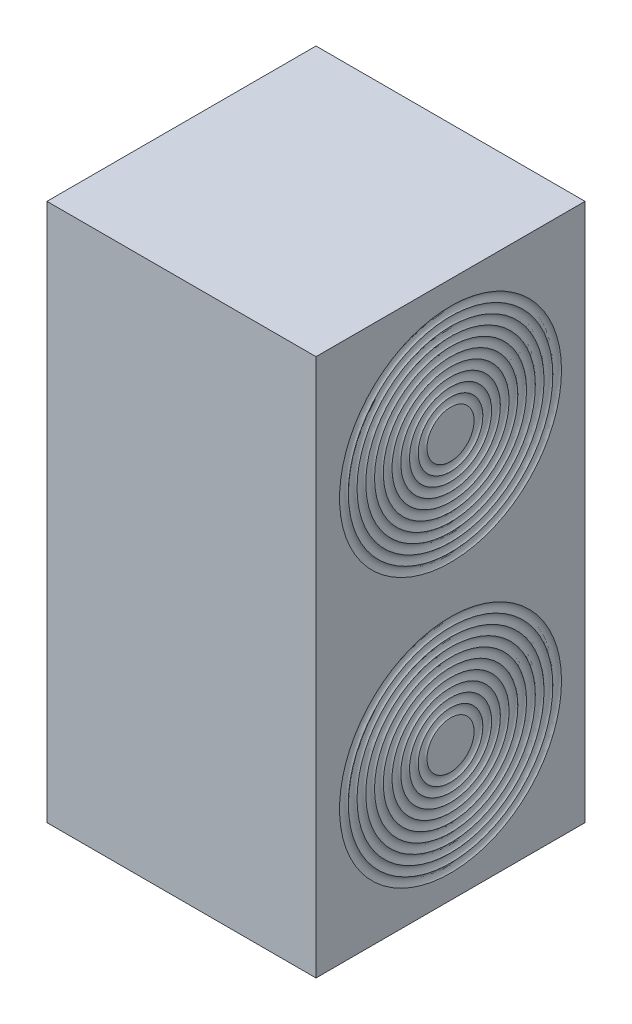
ISO-10303-21;
HEADER;
FILE_DESCRIPTION(('STEP AP214'),'2;1');
FILE_NAME('part.step','',(''),(''),'','','');
FILE_SCHEMA(('AUTOMOTIVE_DESIGN { 1 0 10303 214 1 1 1 1 }'));
ENDSEC;
DATA;
#1=APPLICATION_CONTEXT('core data for automotive mechanical design processes');
#2=APPLICATION_PROTOCOL_DEFINITION('international standard','automotive_design',2000,#1);
#3=PRODUCT_CONTEXT('',#1,'mechanical');
#4=PRODUCT('Part','Part','',(#3));
#5=PRODUCT_RELATED_PRODUCT_CATEGORY('part','',(#4));
#6=PRODUCT_DEFINITION_FORMATION('','',#4);
#7=PRODUCT_DEFINITION_CONTEXT('part definition',#1,'design');
#8=PRODUCT_DEFINITION('design','',#6,#7);
#9=PRODUCT_DEFINITION_SHAPE('','',#8);
#10=(LENGTH_UNIT() NAMED_UNIT(*) SI_UNIT(.MILLI.,.METRE.));
#11=(NAMED_UNIT(*) PLANE_ANGLE_UNIT() SI_UNIT($,.RADIAN.));
#12=(NAMED_UNIT(*) SI_UNIT($,.STERADIAN.) SOLID_ANGLE_UNIT());
#13=UNCERTAINTY_MEASURE_WITH_UNIT(LENGTH_MEASURE(1.E-05),#10,'distance_accuracy_value','');
#14=(GEOMETRIC_REPRESENTATION_CONTEXT(3) GLOBAL_UNCERTAINTY_ASSIGNED_CONTEXT((#13)) GLOBAL_UNIT_ASSIGNED_CONTEXT((#10,
#11,#12)) REPRESENTATION_CONTEXT('',''));
#15=CARTESIAN_POINT('',(0.,0.,0.));
#16=DIRECTION('',(0.,0.,1.));
#17=DIRECTION('',(1.,0.,0.));
#18=AXIS2_PLACEMENT_3D('',#15,#16,#17);
#19=CARTESIAN_POINT('',(-20.,10.,0.));
#20=DIRECTION('',(1.,0.,0.));
#21=DIRECTION('',(0.,0.,-1.));
#22=AXIS2_PLACEMENT_3D('',#19,#20,#21);
#23=PLANE('',#22);
#24=CARTESIAN_POINT('',(-20.,20.,0.));
#25=DIRECTION('',(-1.,0.,0.));
#26=DIRECTION('',(0.,0.,1.));
#27=AXIS2_PLACEMENT_3D('',#24,#25,#26);
#28=CIRCLE('',#27,1.74999999999997);
#29=CARTESIAN_POINT('',(-20.,20.,1.74999999999997));
#30=VERTEX_POINT('',#29);
#31=EDGE_CURVE('E20',#30,#30,#28,.T.);
#32=ORIENTED_EDGE('',*,*,#31,.T.);
#33=EDGE_LOOP('',(#32));
#34=FACE_BOUND('',#33,.T.);
#35=ADVANCED_FACE('F17',(#34),#23,.F.);
#36=CARTESIAN_POINT('',(-20.,10.,0.));
#37=DIRECTION('',(1.,0.,0.));
#38=DIRECTION('',(0.,0.,-1.));
#39=AXIS2_PLACEMENT_3D('',#36,#37,#38);
#40=PLANE('',#39);
#41=CARTESIAN_POINT('',(-20.,0.,0.));
#42=DIRECTION('',(-1.,0.,0.));
#43=DIRECTION('',(0.,0.,1.));
#44=AXIS2_PLACEMENT_3D('',#41,#42,#43);
#45=CIRCLE('',#44,1.74999999999997);
#46=CARTESIAN_POINT('',(-20.,0.,1.74999999999997));
#47=VERTEX_POINT('',#46);
#48=EDGE_CURVE('E477',#47,#47,#45,.T.);
#49=ORIENTED_EDGE('',*,*,#48,.T.);
#50=EDGE_LOOP('',(#49));
#51=FACE_BOUND('',#50,.T.);
#52=ADVANCED_FACE('F431',(#51),#40,.F.);
#53=CARTESIAN_POINT('',(0.,10.,0.));
#54=DIRECTION('',(1.,0.,0.));
#55=DIRECTION('',(0.,0.,-1.));
#56=AXIS2_PLACEMENT_3D('',#53,#54,#55);
#57=PLANE('',#56);
#58=CARTESIAN_POINT('',(0.,20.,0.));
#59=DIRECTION('',(1.,0.,0.));
#60=DIRECTION('',(0.,0.,-1.));
#61=AXIS2_PLACEMENT_3D('',#58,#59,#60);
#62=CIRCLE('',#61,1.75);
#63=CARTESIAN_POINT('',(0.,20.,-1.75));
#64=VERTEX_POINT('',#63);
#65=EDGE_CURVE('E474',#64,#64,#62,.T.);
#66=ORIENTED_EDGE('',*,*,#65,.T.);
#67=EDGE_LOOP('',(#66));
#68=FACE_BOUND('',#67,.T.);
#69=ADVANCED_FACE('F428',(#68),#57,.T.);
#70=CARTESIAN_POINT('',(0.,10.,0.));
#71=DIRECTION('',(1.,0.,0.));
#72=DIRECTION('',(0.,0.,-1.));
#73=AXIS2_PLACEMENT_3D('',#70,#71,#72);
#74=PLANE('',#73);
#75=CARTESIAN_POINT('',(0.,0.,0.));
#76=DIRECTION('',(1.,0.,0.));
#77=DIRECTION('',(0.,0.,-1.));
#78=AXIS2_PLACEMENT_3D('',#75,#76,#77);
#79=CIRCLE('',#78,1.75);
#80=CARTESIAN_POINT('',(0.,0.,-1.75));
#81=VERTEX_POINT('',#80);
#82=EDGE_CURVE('E470',#81,#81,#79,.T.);
#83=ORIENTED_EDGE('',*,*,#82,.T.);
#84=EDGE_LOOP('',(#83));
#85=FACE_BOUND('',#84,.T.);
#86=ADVANCED_FACE('F424',(#85),#74,.T.);
#87=CARTESIAN_POINT('',(-20.2770833333333,20.,0.));
#88=DIRECTION('',(-1.,0.,0.));
#89=DIRECTION('',(0.,0.,-1.));
#90=AXIS2_PLACEMENT_3D('',#87,#88,#89);
#91=TOROIDAL_SURFACE('',#90,2.075,0.427083333333337);
#92=ORIENTED_EDGE('',*,*,#31,.F.);
#93=EDGE_LOOP('',(#92));
#94=FACE_BOUND('',#93,.T.);
#95=CARTESIAN_POINT('',(-20.,20.,0.));
#96=DIRECTION('',(-1.,0.,0.));
#97=DIRECTION('',(0.,0.,-1.));
#98=AXIS2_PLACEMENT_3D('',#95,#96,#97);
#99=CIRCLE('',#98,2.39999999999998);
#100=CARTESIAN_POINT('',(-20.,20.,-2.39999999999998));
#101=VERTEX_POINT('',#100);
#102=EDGE_CURVE('E415',#101,#101,#99,.T.);
#103=ORIENTED_EDGE('',*,*,#102,.T.);
#104=EDGE_LOOP('',(#103));
#105=FACE_BOUND('',#104,.T.);
#106=ADVANCED_FACE('F421',(#94,#105),#91,.F.);
#107=CARTESIAN_POINT('',(-20.2770833333333,0.,0.));
#108=DIRECTION('',(-1.,0.,0.));
#109=DIRECTION('',(0.,0.,-1.));
#110=AXIS2_PLACEMENT_3D('',#107,#108,#109);
#111=TOROIDAL_SURFACE('',#110,2.075,0.427083333333337);
#112=CARTESIAN_POINT('',(-20.,0.,0.));
#113=DIRECTION('',(-1.,0.,0.));
#114=DIRECTION('',(0.,0.,-1.));
#115=AXIS2_PLACEMENT_3D('',#112,#113,#114);
#116=CIRCLE('',#115,2.39999999999998);
#117=CARTESIAN_POINT('',(-20.,0.,-2.39999999999998));
#118=VERTEX_POINT('',#117);
#119=EDGE_CURVE('E412',#118,#118,#116,.T.);
#120=ORIENTED_EDGE('',*,*,#119,.T.);
#121=EDGE_LOOP('',(#120));
#122=FACE_BOUND('',#121,.T.);
#123=ORIENTED_EDGE('',*,*,#48,.F.);
#124=EDGE_LOOP('',(#123));
#125=FACE_BOUND('',#124,.T.);
#126=ADVANCED_FACE('F406',(#122,#125),#111,.F.);
#127=CARTESIAN_POINT('',(0.277083333333337,20.,0.));
#128=DIRECTION('',(1.,0.,0.));
#129=DIRECTION('',(0.,0.,-1.));
#130=AXIS2_PLACEMENT_3D('',#127,#128,#129);
#131=TOROIDAL_SURFACE('',#130,2.075,0.427083333333337);
#132=ORIENTED_EDGE('',*,*,#65,.F.);
#133=EDGE_LOOP('',(#132));
#134=FACE_BOUND('',#133,.T.);
#135=CARTESIAN_POINT('',(0.,20.,0.));
#136=DIRECTION('',(1.,0.,0.));
#137=DIRECTION('',(0.,0.,-1.));
#138=AXIS2_PLACEMENT_3D('',#135,#136,#137);
#139=CIRCLE('',#138,2.4);
#140=CARTESIAN_POINT('',(0.,20.,-2.4));
#141=VERTEX_POINT('',#140);
#142=EDGE_CURVE('E395',#141,#141,#139,.T.);
#143=ORIENTED_EDGE('',*,*,#142,.T.);
#144=EDGE_LOOP('',(#143));
#145=FACE_BOUND('',#144,.T.);
#146=ADVANCED_FACE('F402',(#134,#145),#131,.F.);
#147=CARTESIAN_POINT('',(0.277083333333337,0.,0.));
#148=DIRECTION('',(1.,0.,0.));
#149=DIRECTION('',(0.,0.,-1.));
#150=AXIS2_PLACEMENT_3D('',#147,#148,#149);
#151=TOROIDAL_SURFACE('',#150,2.075,0.427083333333337);
#152=ORIENTED_EDGE('',*,*,#82,.F.);
#153=EDGE_LOOP('',(#152));
#154=FACE_BOUND('',#153,.T.);
#155=CARTESIAN_POINT('',(0.,0.,0.));
#156=DIRECTION('',(1.,0.,0.));
#157=DIRECTION('',(0.,0.,-1.));
#158=AXIS2_PLACEMENT_3D('',#155,#156,#157);
#159=CIRCLE('',#158,2.4);
#160=CARTESIAN_POINT('',(0.,0.,-2.4));
#161=VERTEX_POINT('',#160);
#162=EDGE_CURVE('E389',#161,#161,#159,.T.);
#163=ORIENTED_EDGE('',*,*,#162,.T.);
#164=EDGE_LOOP('',(#163));
#165=FACE_BOUND('',#164,.T.);
#166=ADVANCED_FACE('F399',(#154,#165),#151,.F.);
#167=CARTESIAN_POINT('',(-20.2770833333333,20.,0.));
#168=DIRECTION('',(-1.,0.,0.));
#169=DIRECTION('',(0.,0.,-1.));
#170=AXIS2_PLACEMENT_3D('',#167,#168,#169);
#171=TOROIDAL_SURFACE('',#170,2.725,0.427083333333337);
#172=CARTESIAN_POINT('',(-20.,20.,0.));
#173=DIRECTION('',(-1.,0.,0.));
#174=DIRECTION('',(0.,0.,-1.));
#175=AXIS2_PLACEMENT_3D('',#172,#173,#174);
#176=CIRCLE('',#175,3.04999999999998);
#177=CARTESIAN_POINT('',(-20.,20.,-3.04999999999998));
#178=VERTEX_POINT('',#177);
#179=EDGE_CURVE('E386',#178,#178,#176,.T.);
#180=ORIENTED_EDGE('',*,*,#179,.T.);
#181=EDGE_LOOP('',(#180));
#182=FACE_BOUND('',#181,.T.);
#183=ORIENTED_EDGE('',*,*,#102,.F.);
#184=EDGE_LOOP('',(#183));
#185=FACE_BOUND('',#184,.T.);
#186=ADVANCED_FACE('F380',(#182,#185),#171,.F.);
#187=CARTESIAN_POINT('',(-20.2770833333333,0.,0.));
#188=DIRECTION('',(-1.,0.,0.));
#189=DIRECTION('',(0.,0.,-1.));
#190=AXIS2_PLACEMENT_3D('',#187,#188,#189);
#191=TOROIDAL_SURFACE('',#190,2.725,0.427083333333337);
#192=ORIENTED_EDGE('',*,*,#119,.F.);
#193=EDGE_LOOP('',(#192));
#194=FACE_BOUND('',#193,.T.);
#195=CARTESIAN_POINT('',(-20.,0.,0.));
#196=DIRECTION('',(-1.,0.,0.));
#197=DIRECTION('',(0.,0.,-1.));
#198=AXIS2_PLACEMENT_3D('',#195,#196,#197);
#199=CIRCLE('',#198,3.04999999999998);
#200=CARTESIAN_POINT('',(-20.,0.,-3.04999999999998));
#201=VERTEX_POINT('',#200);
#202=EDGE_CURVE('E369',#201,#201,#199,.T.);
#203=ORIENTED_EDGE('',*,*,#202,.T.);
#204=EDGE_LOOP('',(#203));
#205=FACE_BOUND('',#204,.T.);
#206=ADVANCED_FACE('F376',(#194,#205),#191,.F.);
#207=CARTESIAN_POINT('',(0.277083333333337,20.,0.));
#208=DIRECTION('',(1.,0.,0.));
#209=DIRECTION('',(0.,0.,-1.));
#210=AXIS2_PLACEMENT_3D('',#207,#208,#209);
#211=TOROIDAL_SURFACE('',#210,2.725,0.427083333333337);
#212=ORIENTED_EDGE('',*,*,#142,.F.);
#213=EDGE_LOOP('',(#212));
#214=FACE_BOUND('',#213,.T.);
#215=CARTESIAN_POINT('',(0.,20.,0.));
#216=DIRECTION('',(1.,0.,0.));
#217=DIRECTION('',(0.,0.,-1.));
#218=AXIS2_PLACEMENT_3D('',#215,#216,#217);
#219=CIRCLE('',#218,3.05);
#220=CARTESIAN_POINT('',(0.,20.,-3.05));
#221=VERTEX_POINT('',#220);
#222=EDGE_CURVE('E365',#221,#221,#219,.T.);
#223=ORIENTED_EDGE('',*,*,#222,.T.);
#224=EDGE_LOOP('',(#223));
#225=FACE_BOUND('',#224,.T.);
#226=ADVANCED_FACE('F373',(#214,#225),#211,.F.);
#227=CARTESIAN_POINT('',(0.277083333333337,0.,0.));
#228=DIRECTION('',(1.,0.,0.));
#229=DIRECTION('',(0.,0.,-1.));
#230=AXIS2_PLACEMENT_3D('',#227,#228,#229);
#231=TOROIDAL_SURFACE('',#230,2.725,0.427083333333337);
#232=ORIENTED_EDGE('',*,*,#162,.F.);
#233=EDGE_LOOP('',(#232));
#234=FACE_BOUND('',#233,.T.);
#235=CARTESIAN_POINT('',(0.,0.,0.));
#236=DIRECTION('',(1.,0.,0.));
#237=DIRECTION('',(0.,0.,-1.));
#238=AXIS2_PLACEMENT_3D('',#235,#236,#237);
#239=CIRCLE('',#238,3.05);
#240=CARTESIAN_POINT('',(0.,0.,-3.05));
#241=VERTEX_POINT('',#240);
#242=EDGE_CURVE('E361',#241,#241,#239,.T.);
#243=ORIENTED_EDGE('',*,*,#242,.T.);
#244=EDGE_LOOP('',(#243));
#245=FACE_BOUND('',#244,.T.);
#246=ADVANCED_FACE('F354',(#234,#245),#231,.F.);
#247=CARTESIAN_POINT('',(-20.2770833333333,20.,0.));
#248=DIRECTION('',(-1.,0.,0.));
#249=DIRECTION('',(0.,0.,-1.));
#250=AXIS2_PLACEMENT_3D('',#247,#248,#249);
#251=TOROIDAL_SURFACE('',#250,3.375,0.427083333333337);
#252=ORIENTED_EDGE('',*,*,#179,.F.);
#253=EDGE_LOOP('',(#252));
#254=FACE_BOUND('',#253,.T.);
#255=CARTESIAN_POINT('',(-20.,20.,0.));
#256=DIRECTION('',(-1.,0.,0.));
#257=DIRECTION('',(0.,0.,-1.));
#258=AXIS2_PLACEMENT_3D('',#255,#256,#257);
#259=CIRCLE('',#258,3.69999999999999);
#260=CARTESIAN_POINT('',(-20.,20.,-3.69999999999999));
#261=VERTEX_POINT('',#260);
#262=EDGE_CURVE('E343',#261,#261,#259,.T.);
#263=ORIENTED_EDGE('',*,*,#262,.T.);
#264=EDGE_LOOP('',(#263));
#265=FACE_BOUND('',#264,.T.);
#266=ADVANCED_FACE('F350',(#254,#265),#251,.F.);
#267=CARTESIAN_POINT('',(-20.2770833333333,0.,0.));
#268=DIRECTION('',(-1.,0.,0.));
#269=DIRECTION('',(0.,0.,-1.));
#270=AXIS2_PLACEMENT_3D('',#267,#268,#269);
#271=TOROIDAL_SURFACE('',#270,3.375,0.427083333333337);
#272=ORIENTED_EDGE('',*,*,#202,.F.);
#273=EDGE_LOOP('',(#272));
#274=FACE_BOUND('',#273,.T.);
#275=CARTESIAN_POINT('',(-20.,0.,0.));
#276=DIRECTION('',(-1.,0.,0.));
#277=DIRECTION('',(0.,0.,-1.));
#278=AXIS2_PLACEMENT_3D('',#275,#276,#277);
#279=CIRCLE('',#278,3.69999999999998);
#280=CARTESIAN_POINT('',(-20.,0.,-3.69999999999998));
#281=VERTEX_POINT('',#280);
#282=EDGE_CURVE('E339',#281,#281,#279,.T.);
#283=ORIENTED_EDGE('',*,*,#282,.T.);
#284=EDGE_LOOP('',(#283));
#285=FACE_BOUND('',#284,.T.);
#286=ADVANCED_FACE('F347',(#274,#285),#271,.F.);
#287=CARTESIAN_POINT('',(0.277083333333337,20.,0.));
#288=DIRECTION('',(1.,0.,0.));
#289=DIRECTION('',(0.,0.,-1.));
#290=AXIS2_PLACEMENT_3D('',#287,#288,#289);
#291=TOROIDAL_SURFACE('',#290,3.375,0.427083333333337);
#292=ORIENTED_EDGE('',*,*,#222,.F.);
#293=EDGE_LOOP('',(#292));
#294=FACE_BOUND('',#293,.T.);
#295=CARTESIAN_POINT('',(0.,20.,0.));
#296=DIRECTION('',(1.,0.,0.));
#297=DIRECTION('',(0.,0.,-1.));
#298=AXIS2_PLACEMENT_3D('',#295,#296,#297);
#299=CIRCLE('',#298,3.7);
#300=CARTESIAN_POINT('',(0.,20.,-3.7));
#301=VERTEX_POINT('',#300);
#302=EDGE_CURVE('E336',#301,#301,#299,.T.);
#303=ORIENTED_EDGE('',*,*,#302,.T.);
#304=EDGE_LOOP('',(#303));
#305=FACE_BOUND('',#304,.T.);
#306=ADVANCED_FACE('F328',(#294,#305),#291,.F.);
#307=CARTESIAN_POINT('',(0.277083333333337,0.,0.));
#308=DIRECTION('',(1.,0.,0.));
#309=DIRECTION('',(0.,0.,-1.));
#310=AXIS2_PLACEMENT_3D('',#307,#308,#309);
#311=TOROIDAL_SURFACE('',#310,3.375,0.427083333333337);
#312=CARTESIAN_POINT('',(0.,0.,0.));
#313=DIRECTION('',(1.,0.,0.));
#314=DIRECTION('',(0.,0.,-1.));
#315=AXIS2_PLACEMENT_3D('',#312,#313,#314);
#316=CIRCLE('',#315,3.7);
#317=CARTESIAN_POINT('',(0.,0.,-3.7));
#318=VERTEX_POINT('',#317);
#319=EDGE_CURVE('E333',#318,#318,#316,.T.);
#320=ORIENTED_EDGE('',*,*,#319,.T.);
#321=EDGE_LOOP('',(#320));
#322=FACE_BOUND('',#321,.T.);
#323=ORIENTED_EDGE('',*,*,#242,.F.);
#324=EDGE_LOOP('',(#323));
#325=FACE_BOUND('',#324,.T.);
#326=ADVANCED_FACE('F323',(#322,#325),#311,.F.);
#327=CARTESIAN_POINT('',(-20.2770833333333,20.,0.));
#328=DIRECTION('',(-1.,0.,0.));
#329=DIRECTION('',(0.,0.,-1.));
#330=AXIS2_PLACEMENT_3D('',#327,#328,#329);
#331=TOROIDAL_SURFACE('',#330,4.025,0.427083333333337);
#332=ORIENTED_EDGE('',*,*,#262,.F.);
#333=EDGE_LOOP('',(#332));
#334=FACE_BOUND('',#333,.T.);
#335=CARTESIAN_POINT('',(-20.,20.,0.));
#336=DIRECTION('',(-1.,0.,0.));
#337=DIRECTION('',(0.,0.,-1.));
#338=AXIS2_PLACEMENT_3D('',#335,#336,#337);
#339=CIRCLE('',#338,4.34999999999998);
#340=CARTESIAN_POINT('',(-20.,20.,-4.34999999999998));
#341=VERTEX_POINT('',#340);
#342=EDGE_CURVE('E314',#341,#341,#339,.T.);
#343=ORIENTED_EDGE('',*,*,#342,.T.);
#344=EDGE_LOOP('',(#343));
#345=FACE_BOUND('',#344,.T.);
#346=ADVANCED_FACE('F320',(#334,#345),#331,.F.);
#347=CARTESIAN_POINT('',(-20.2770833333333,0.,0.));
#348=DIRECTION('',(-1.,0.,0.));
#349=DIRECTION('',(0.,0.,-1.));
#350=AXIS2_PLACEMENT_3D('',#347,#348,#349);
#351=TOROIDAL_SURFACE('',#350,4.025,0.427083333333337);
#352=ORIENTED_EDGE('',*,*,#282,.F.);
#353=EDGE_LOOP('',(#352));
#354=FACE_BOUND('',#353,.T.);
#355=CARTESIAN_POINT('',(-20.,0.,0.));
#356=DIRECTION('',(-1.,0.,0.));
#357=DIRECTION('',(0.,0.,-1.));
#358=AXIS2_PLACEMENT_3D('',#355,#356,#357);
#359=CIRCLE('',#358,4.34999999999998);
#360=CARTESIAN_POINT('',(-20.,0.,-4.34999999999998));
#361=VERTEX_POINT('',#360);
#362=EDGE_CURVE('E311',#361,#361,#359,.T.);
#363=ORIENTED_EDGE('',*,*,#362,.T.);
#364=EDGE_LOOP('',(#363));
#365=FACE_BOUND('',#364,.T.);
#366=ADVANCED_FACE('F305',(#354,#365),#351,.F.);
#367=CARTESIAN_POINT('',(0.277083333333337,20.,0.));
#368=DIRECTION('',(1.,0.,0.));
#369=DIRECTION('',(0.,0.,-1.));
#370=AXIS2_PLACEMENT_3D('',#367,#368,#369);
#371=TOROIDAL_SURFACE('',#370,4.025,0.427083333333337);
#372=CARTESIAN_POINT('',(0.,20.,0.));
#373=DIRECTION('',(1.,0.,0.));
#374=DIRECTION('',(0.,0.,-1.));
#375=AXIS2_PLACEMENT_3D('',#372,#373,#374);
#376=CIRCLE('',#375,4.35);
#377=CARTESIAN_POINT('',(0.,20.,-4.35));
#378=VERTEX_POINT('',#377);
#379=EDGE_CURVE('E294',#378,#378,#376,.T.);
#380=ORIENTED_EDGE('',*,*,#379,.T.);
#381=EDGE_LOOP('',(#380));
#382=FACE_BOUND('',#381,.T.);
#383=ORIENTED_EDGE('',*,*,#302,.F.);
#384=EDGE_LOOP('',(#383));
#385=FACE_BOUND('',#384,.T.);
#386=ADVANCED_FACE('F301',(#382,#385),#371,.F.);
#387=CARTESIAN_POINT('',(0.277083333333337,0.,0.));
#388=DIRECTION('',(1.,0.,0.));
#389=DIRECTION('',(0.,0.,-1.));
#390=AXIS2_PLACEMENT_3D('',#387,#388,#389);
#391=TOROIDAL_SURFACE('',#390,4.025,0.427083333333337);
#392=ORIENTED_EDGE('',*,*,#319,.F.);
#393=EDGE_LOOP('',(#392));
#394=FACE_BOUND('',#393,.T.);
#395=CARTESIAN_POINT('',(0.,0.,0.));
#396=DIRECTION('',(1.,0.,0.));
#397=DIRECTION('',(0.,0.,-1.));
#398=AXIS2_PLACEMENT_3D('',#395,#396,#397);
#399=CIRCLE('',#398,4.35);
#400=CARTESIAN_POINT('',(0.,0.,-4.35));
#401=VERTEX_POINT('',#400);
#402=EDGE_CURVE('E288',#401,#401,#399,.T.);
#403=ORIENTED_EDGE('',*,*,#402,.T.);
#404=EDGE_LOOP('',(#403));
#405=FACE_BOUND('',#404,.T.);
#406=ADVANCED_FACE('F298',(#394,#405),#391,.F.);
#407=CARTESIAN_POINT('',(-20.2770833333333,20.,0.));
#408=DIRECTION('',(-1.,0.,0.));
#409=DIRECTION('',(0.,0.,-1.));
#410=AXIS2_PLACEMENT_3D('',#407,#408,#409);
#411=TOROIDAL_SURFACE('',#410,4.675,0.427083333333337);
#412=CARTESIAN_POINT('',(-20.,20.,0.));
#413=DIRECTION('',(-1.,0.,0.));
#414=DIRECTION('',(0.,0.,-1.));
#415=AXIS2_PLACEMENT_3D('',#412,#413,#414);
#416=CIRCLE('',#415,4.99999999999998);
#417=CARTESIAN_POINT('',(-20.,20.,-4.99999999999998));
#418=VERTEX_POINT('',#417);
#419=EDGE_CURVE('E285',#418,#418,#416,.T.);
#420=ORIENTED_EDGE('',*,*,#419,.T.);
#421=EDGE_LOOP('',(#420));
#422=FACE_BOUND('',#421,.T.);
#423=ORIENTED_EDGE('',*,*,#342,.F.);
#424=EDGE_LOOP('',(#423));
#425=FACE_BOUND('',#424,.T.);
#426=ADVANCED_FACE('F275',(#422,#425),#411,.F.);
#427=CARTESIAN_POINT('',(-20.2770833333333,0.,0.));
#428=DIRECTION('',(-1.,0.,0.));
#429=DIRECTION('',(0.,0.,-1.));
#430=AXIS2_PLACEMENT_3D('',#427,#428,#429);
#431=TOROIDAL_SURFACE('',#430,4.675,0.427083333333337);
#432=ORIENTED_EDGE('',*,*,#362,.F.);
#433=EDGE_LOOP('',(#432));
#434=FACE_BOUND('',#433,.T.);
#435=CARTESIAN_POINT('',(-20.,0.,0.));
#436=DIRECTION('',(-1.,0.,0.));
#437=DIRECTION('',(0.,0.,-1.));
#438=AXIS2_PLACEMENT_3D('',#435,#436,#437);
#439=CIRCLE('',#438,4.99999999999998);
#440=CARTESIAN_POINT('',(-20.,0.,-4.99999999999998));
#441=VERTEX_POINT('',#440);
#442=EDGE_CURVE('E281',#441,#441,#439,.T.);
#443=ORIENTED_EDGE('',*,*,#442,.T.);
#444=EDGE_LOOP('',(#443));
#445=FACE_BOUND('',#444,.T.);
#446=ADVANCED_FACE('F270',(#434,#445),#431,.F.);
#447=CARTESIAN_POINT('',(0.277083333333337,20.,0.));
#448=DIRECTION('',(1.,0.,0.));
#449=DIRECTION('',(0.,0.,-1.));
#450=AXIS2_PLACEMENT_3D('',#447,#448,#449);
#451=TOROIDAL_SURFACE('',#450,4.675,0.427083333333337);
#452=ORIENTED_EDGE('',*,*,#379,.F.);
#453=EDGE_LOOP('',(#452));
#454=FACE_BOUND('',#453,.T.);
#455=CARTESIAN_POINT('',(0.,20.,0.));
#456=DIRECTION('',(1.,0.,0.));
#457=DIRECTION('',(0.,0.,-1.));
#458=AXIS2_PLACEMENT_3D('',#455,#456,#457);
#459=CIRCLE('',#458,5.);
#460=CARTESIAN_POINT('',(0.,20.,-5.));
#461=VERTEX_POINT('',#460);
#462=EDGE_CURVE('E258',#461,#461,#459,.T.);
#463=ORIENTED_EDGE('',*,*,#462,.T.);
#464=EDGE_LOOP('',(#463));
#465=FACE_BOUND('',#464,.T.);
#466=ADVANCED_FACE('F266',(#454,#465),#451,.F.);
#467=CARTESIAN_POINT('',(0.277083333333337,0.,0.));
#468=DIRECTION('',(1.,0.,0.));
#469=DIRECTION('',(0.,0.,-1.));
#470=AXIS2_PLACEMENT_3D('',#467,#468,#469);
#471=TOROIDAL_SURFACE('',#470,4.675,0.427083333333337);
#472=ORIENTED_EDGE('',*,*,#402,.F.);
#473=EDGE_LOOP('',(#472));
#474=FACE_BOUND('',#473,.T.);
#475=CARTESIAN_POINT('',(0.,0.,0.));
#476=DIRECTION('',(1.,0.,0.));
#477=DIRECTION('',(0.,0.,-1.));
#478=AXIS2_PLACEMENT_3D('',#475,#476,#477);
#479=CIRCLE('',#478,5.);
#480=CARTESIAN_POINT('',(0.,0.,-5.));
#481=VERTEX_POINT('',#480);
#482=EDGE_CURVE('E254',#481,#481,#479,.T.);
#483=ORIENTED_EDGE('',*,*,#482,.T.);
#484=EDGE_LOOP('',(#483));
#485=FACE_BOUND('',#484,.T.);
#486=ADVANCED_FACE('F263',(#474,#485),#471,.F.);
#487=CARTESIAN_POINT('',(-20.2770833333333,20.,0.));
#488=DIRECTION('',(-1.,0.,0.));
#489=DIRECTION('',(0.,0.,-1.));
#490=AXIS2_PLACEMENT_3D('',#487,#488,#489);
#491=TOROIDAL_SURFACE('',#490,5.325,0.427083333333337);
#492=ORIENTED_EDGE('',*,*,#419,.F.);
#493=EDGE_LOOP('',(#492));
#494=FACE_BOUND('',#493,.T.);
#495=CARTESIAN_POINT('',(-20.,20.,0.));
#496=DIRECTION('',(-1.,0.,0.));
#497=DIRECTION('',(0.,0.,-1.));
#498=AXIS2_PLACEMENT_3D('',#495,#496,#497);
#499=CIRCLE('',#498,5.64999999999998);
#500=CARTESIAN_POINT('',(-20.,20.,-5.64999999999998));
#501=VERTEX_POINT('',#500);
#502=EDGE_CURVE('E250',#501,#501,#499,.T.);
#503=ORIENTED_EDGE('',*,*,#502,.T.);
#504=EDGE_LOOP('',(#503));
#505=FACE_BOUND('',#504,.T.);
#506=ADVANCED_FACE('F243',(#494,#505),#491,.F.);
#507=CARTESIAN_POINT('',(-20.2770833333333,0.,0.));
#508=DIRECTION('',(-1.,0.,0.));
#509=DIRECTION('',(0.,0.,-1.));
#510=AXIS2_PLACEMENT_3D('',#507,#508,#509);
#511=TOROIDAL_SURFACE('',#510,5.325,0.427083333333337);
#512=CARTESIAN_POINT('',(-20.,0.,0.));
#513=DIRECTION('',(-1.,0.,0.));
#514=DIRECTION('',(0.,0.,-1.));
#515=AXIS2_PLACEMENT_3D('',#512,#513,#514);
#516=CIRCLE('',#515,5.64999999999998);
#517=CARTESIAN_POINT('',(-20.,0.,-5.64999999999998));
#518=VERTEX_POINT('',#517);
#519=EDGE_CURVE('E232',#518,#518,#516,.T.);
#520=ORIENTED_EDGE('',*,*,#519,.T.);
#521=EDGE_LOOP('',(#520));
#522=FACE_BOUND('',#521,.T.);
#523=ORIENTED_EDGE('',*,*,#442,.F.);
#524=EDGE_LOOP('',(#523));
#525=FACE_BOUND('',#524,.T.);
#526=ADVANCED_FACE('F239',(#522,#525),#511,.F.);
#527=CARTESIAN_POINT('',(0.277083333333337,20.,0.));
#528=DIRECTION('',(1.,0.,0.));
#529=DIRECTION('',(0.,0.,-1.));
#530=AXIS2_PLACEMENT_3D('',#527,#528,#529);
#531=TOROIDAL_SURFACE('',#530,5.325,0.427083333333337);
#532=CARTESIAN_POINT('',(0.,20.,0.));
#533=DIRECTION('',(1.,0.,0.));
#534=DIRECTION('',(0.,0.,-1.));
#535=AXIS2_PLACEMENT_3D('',#532,#533,#534);
#536=CIRCLE('',#535,5.65);
#537=CARTESIAN_POINT('',(0.,20.,-5.65));
#538=VERTEX_POINT('',#537);
#539=EDGE_CURVE('E228',#538,#538,#536,.T.);
#540=ORIENTED_EDGE('',*,*,#539,.T.);
#541=EDGE_LOOP('',(#540));
#542=FACE_BOUND('',#541,.T.);
#543=ORIENTED_EDGE('',*,*,#462,.F.);
#544=EDGE_LOOP('',(#543));
#545=FACE_BOUND('',#544,.T.);
#546=ADVANCED_FACE('F236',(#542,#545),#531,.F.);
#547=CARTESIAN_POINT('',(0.277083333333337,0.,0.));
#548=DIRECTION('',(1.,0.,0.));
#549=DIRECTION('',(0.,0.,-1.));
#550=AXIS2_PLACEMENT_3D('',#547,#548,#549);
#551=TOROIDAL_SURFACE('',#550,5.325,0.427083333333337);
#552=ORIENTED_EDGE('',*,*,#482,.F.);
#553=EDGE_LOOP('',(#552));
#554=FACE_BOUND('',#553,.T.);
#555=CARTESIAN_POINT('',(0.,0.,0.));
#556=DIRECTION('',(1.,0.,0.));
#557=DIRECTION('',(0.,0.,-1.));
#558=AXIS2_PLACEMENT_3D('',#555,#556,#557);
#559=CIRCLE('',#558,5.65);
#560=CARTESIAN_POINT('',(0.,0.,-5.65));
#561=VERTEX_POINT('',#560);
#562=EDGE_CURVE('E224',#561,#561,#559,.T.);
#563=ORIENTED_EDGE('',*,*,#562,.T.);
#564=EDGE_LOOP('',(#563));
#565=FACE_BOUND('',#564,.T.);
#566=ADVANCED_FACE('F216',(#554,#565),#551,.F.);
#567=CARTESIAN_POINT('',(-20.2770833333333,20.,0.));
#568=DIRECTION('',(-1.,0.,0.));
#569=DIRECTION('',(0.,0.,-1.));
#570=AXIS2_PLACEMENT_3D('',#567,#568,#569);
#571=TOROIDAL_SURFACE('',#570,5.975,0.427083333333337);
#572=CARTESIAN_POINT('',(-20.,20.,0.));
#573=DIRECTION('',(-1.,0.,0.));
#574=DIRECTION('',(0.,0.,-1.));
#575=AXIS2_PLACEMENT_3D('',#572,#573,#574);
#576=CIRCLE('',#575,6.29999999999998);
#577=CARTESIAN_POINT('',(-20.,20.,-6.29999999999998));
#578=VERTEX_POINT('',#577);
#579=EDGE_CURVE('E221',#578,#578,#576,.T.);
#580=ORIENTED_EDGE('',*,*,#579,.T.);
#581=EDGE_LOOP('',(#580));
#582=FACE_BOUND('',#581,.T.);
#583=ORIENTED_EDGE('',*,*,#502,.F.);
#584=EDGE_LOOP('',(#583));
#585=FACE_BOUND('',#584,.T.);
#586=ADVANCED_FACE('F211',(#582,#585),#571,.F.);
#587=CARTESIAN_POINT('',(-20.2770833333333,0.,0.));
#588=DIRECTION('',(-1.,0.,0.));
#589=DIRECTION('',(0.,0.,-1.));
#590=AXIS2_PLACEMENT_3D('',#587,#588,#589);
#591=TOROIDAL_SURFACE('',#590,5.975,0.427083333333337);
#592=ORIENTED_EDGE('',*,*,#519,.F.);
#593=EDGE_LOOP('',(#592));
#594=FACE_BOUND('',#593,.T.);
#595=CARTESIAN_POINT('',(-20.,0.,0.));
#596=DIRECTION('',(-1.,0.,0.));
#597=DIRECTION('',(0.,0.,-1.));
#598=AXIS2_PLACEMENT_3D('',#595,#596,#597);
#599=CIRCLE('',#598,6.29999999999998);
#600=CARTESIAN_POINT('',(-20.,0.,-6.29999999999998));
#601=VERTEX_POINT('',#600);
#602=EDGE_CURVE('E204',#601,#601,#599,.T.);
#603=ORIENTED_EDGE('',*,*,#602,.T.);
#604=EDGE_LOOP('',(#603));
#605=FACE_BOUND('',#604,.T.);
#606=ADVANCED_FACE('F208',(#594,#605),#591,.F.);
#607=CARTESIAN_POINT('',(0.277083333333337,20.,0.));
#608=DIRECTION('',(1.,0.,0.));
#609=DIRECTION('',(0.,0.,-1.));
#610=AXIS2_PLACEMENT_3D('',#607,#608,#609);
#611=TOROIDAL_SURFACE('',#610,5.975,0.427083333333337);
#612=ORIENTED_EDGE('',*,*,#539,.F.);
#613=EDGE_LOOP('',(#612));
#614=FACE_BOUND('',#613,.T.);
#615=CARTESIAN_POINT('',(0.,20.,0.));
#616=DIRECTION('',(1.,0.,0.));
#617=DIRECTION('',(0.,0.,-1.));
#618=AXIS2_PLACEMENT_3D('',#615,#616,#617);
#619=CIRCLE('',#618,6.3);
#620=CARTESIAN_POINT('',(0.,20.,-6.3));
#621=VERTEX_POINT('',#620);
#622=EDGE_CURVE('E200',#621,#621,#619,.T.);
#623=ORIENTED_EDGE('',*,*,#622,.T.);
#624=EDGE_LOOP('',(#623));
#625=FACE_BOUND('',#624,.T.);
#626=ADVANCED_FACE('F193',(#614,#625),#611,.F.);
#627=CARTESIAN_POINT('',(0.277083333333337,0.,0.));
#628=DIRECTION('',(1.,0.,0.));
#629=DIRECTION('',(0.,0.,-1.));
#630=AXIS2_PLACEMENT_3D('',#627,#628,#629);
#631=TOROIDAL_SURFACE('',#630,5.975,0.427083333333337);
#632=CARTESIAN_POINT('',(0.,0.,0.));
#633=DIRECTION('',(1.,0.,0.));
#634=DIRECTION('',(0.,0.,-1.));
#635=AXIS2_PLACEMENT_3D('',#632,#633,#634);
#636=CIRCLE('',#635,6.3);
#637=CARTESIAN_POINT('',(0.,0.,-6.3));
#638=VERTEX_POINT('',#637);
#639=EDGE_CURVE('E182',#638,#638,#636,.T.);
#640=ORIENTED_EDGE('',*,*,#639,.T.);
#641=EDGE_LOOP('',(#640));
#642=FACE_BOUND('',#641,.T.);
#643=ORIENTED_EDGE('',*,*,#562,.F.);
#644=EDGE_LOOP('',(#643));
#645=FACE_BOUND('',#644,.T.);
#646=ADVANCED_FACE('F189',(#642,#645),#631,.F.);
#647=CARTESIAN_POINT('',(-20.2770833333333,20.,0.));
#648=DIRECTION('',(-1.,0.,0.));
#649=DIRECTION('',(0.,0.,-1.));
#650=AXIS2_PLACEMENT_3D('',#647,#648,#649);
#651=TOROIDAL_SURFACE('',#650,6.625,0.427083333333337);
#652=ORIENTED_EDGE('',*,*,#579,.F.);
#653=EDGE_LOOP('',(#652));
#654=FACE_BOUND('',#653,.T.);
#655=CARTESIAN_POINT('',(-20.,20.,0.));
#656=DIRECTION('',(-1.,0.,0.));
#657=DIRECTION('',(0.,0.,-1.));
#658=AXIS2_PLACEMENT_3D('',#655,#656,#657);
#659=CIRCLE('',#658,6.94999999999998);
#660=CARTESIAN_POINT('',(-20.,20.,-6.94999999999998));
#661=VERTEX_POINT('',#660);
#662=EDGE_CURVE('E176',#661,#661,#659,.T.);
#663=ORIENTED_EDGE('',*,*,#662,.T.);
#664=EDGE_LOOP('',(#663));
#665=FACE_BOUND('',#664,.T.);
#666=ADVANCED_FACE('F186',(#654,#665),#651,.F.);
#667=CARTESIAN_POINT('',(-20.2770833333333,0.,0.));
#668=DIRECTION('',(-1.,0.,0.));
#669=DIRECTION('',(0.,0.,-1.));
#670=AXIS2_PLACEMENT_3D('',#667,#668,#669);
#671=TOROIDAL_SURFACE('',#670,6.625,0.427083333333337);
#672=CARTESIAN_POINT('',(-20.,0.,0.));
#673=DIRECTION('',(-1.,0.,0.));
#674=DIRECTION('',(0.,0.,-1.));
#675=AXIS2_PLACEMENT_3D('',#672,#673,#674);
#676=CIRCLE('',#675,6.94999999999998);
#677=CARTESIAN_POINT('',(-20.,0.,-6.94999999999998));
#678=VERTEX_POINT('',#677);
#679=EDGE_CURVE('E173',#678,#678,#676,.T.);
#680=ORIENTED_EDGE('',*,*,#679,.T.);
#681=EDGE_LOOP('',(#680));
#682=FACE_BOUND('',#681,.T.);
#683=ORIENTED_EDGE('',*,*,#602,.F.);
#684=EDGE_LOOP('',(#683));
#685=FACE_BOUND('',#684,.T.);
#686=ADVANCED_FACE('F166',(#682,#685),#671,.F.);
#687=CARTESIAN_POINT('',(0.277083333333337,20.,0.));
#688=DIRECTION('',(1.,0.,0.));
#689=DIRECTION('',(0.,0.,-1.));
#690=AXIS2_PLACEMENT_3D('',#687,#688,#689);
#691=TOROIDAL_SURFACE('',#690,6.625,0.427083333333337);
#692=CARTESIAN_POINT('',(0.,20.,0.));
#693=DIRECTION('',(1.,0.,0.));
#694=DIRECTION('',(0.,0.,-1.));
#695=AXIS2_PLACEMENT_3D('',#692,#693,#694);
#696=CIRCLE('',#695,6.95);
#697=CARTESIAN_POINT('',(0.,20.,-6.95));
#698=VERTEX_POINT('',#697);
#699=EDGE_CURVE('E172',#698,#698,#696,.T.);
#700=ORIENTED_EDGE('',*,*,#699,.T.);
#701=EDGE_LOOP('',(#700));
#702=FACE_BOUND('',#701,.T.);
#703=ORIENTED_EDGE('',*,*,#622,.F.);
#704=EDGE_LOOP('',(#703));
#705=FACE_BOUND('',#704,.T.);
#706=ADVANCED_FACE('F161',(#702,#705),#691,.F.);
#707=CARTESIAN_POINT('',(0.277083333333337,0.,0.));
#708=DIRECTION('',(1.,0.,0.));
#709=DIRECTION('',(0.,0.,-1.));
#710=AXIS2_PLACEMENT_3D('',#707,#708,#709);
#711=TOROIDAL_SURFACE('',#710,6.625,0.427083333333337);
#712=ORIENTED_EDGE('',*,*,#639,.F.);
#713=EDGE_LOOP('',(#712));
#714=FACE_BOUND('',#713,.T.);
#715=CARTESIAN_POINT('',(0.,0.,0.));
#716=DIRECTION('',(1.,0.,0.));
#717=DIRECTION('',(0.,0.,-1.));
#718=AXIS2_PLACEMENT_3D('',#715,#716,#717);
#719=CIRCLE('',#718,6.95);
#720=CARTESIAN_POINT('',(0.,0.,-6.95));
#721=VERTEX_POINT('',#720);
#722=EDGE_CURVE('E154',#721,#721,#719,.T.);
#723=ORIENTED_EDGE('',*,*,#722,.T.);
#724=EDGE_LOOP('',(#723));
#725=FACE_BOUND('',#724,.T.);
#726=ADVANCED_FACE('F158',(#714,#725),#711,.F.);
#727=CARTESIAN_POINT('',(-20.2770833333333,20.,0.));
#728=DIRECTION('',(-1.,0.,0.));
#729=DIRECTION('',(0.,0.,-1.));
#730=AXIS2_PLACEMENT_3D('',#727,#728,#729);
#731=TOROIDAL_SURFACE('',#730,7.275,0.427083333333337);
#732=ORIENTED_EDGE('',*,*,#662,.F.);
#733=EDGE_LOOP('',(#732));
#734=FACE_BOUND('',#733,.T.);
#735=CARTESIAN_POINT('',(-20.,20.,0.));
#736=DIRECTION('',(-1.,0.,0.));
#737=DIRECTION('',(0.,0.,-1.));
#738=AXIS2_PLACEMENT_3D('',#735,#736,#737);
#739=CIRCLE('',#738,7.59999999999999);
#740=CARTESIAN_POINT('',(-20.,20.,-7.59999999999999));
#741=VERTEX_POINT('',#740);
#742=EDGE_CURVE('E148',#741,#741,#739,.T.);
#743=ORIENTED_EDGE('',*,*,#742,.T.);
#744=EDGE_LOOP('',(#743));
#745=FACE_BOUND('',#744,.T.);
#746=ADVANCED_FACE('F139',(#734,#745),#731,.F.);
#747=CARTESIAN_POINT('',(-20.2770833333333,0.,0.));
#748=DIRECTION('',(-1.,0.,0.));
#749=DIRECTION('',(0.,0.,-1.));
#750=AXIS2_PLACEMENT_3D('',#747,#748,#749);
#751=TOROIDAL_SURFACE('',#750,7.275,0.427083333333337);
#752=ORIENTED_EDGE('',*,*,#679,.F.);
#753=EDGE_LOOP('',(#752));
#754=FACE_BOUND('',#753,.T.);
#755=CARTESIAN_POINT('',(-20.,0.,0.));
#756=DIRECTION('',(-1.,0.,0.));
#757=DIRECTION('',(0.,0.,-1.));
#758=AXIS2_PLACEMENT_3D('',#755,#756,#757);
#759=CIRCLE('',#758,7.59999999999999);
#760=CARTESIAN_POINT('',(-20.,0.,-7.59999999999999));
#761=VERTEX_POINT('',#760);
#762=EDGE_CURVE('E145',#761,#761,#759,.T.);
#763=ORIENTED_EDGE('',*,*,#762,.T.);
#764=EDGE_LOOP('',(#763));
#765=FACE_BOUND('',#764,.T.);
#766=ADVANCED_FACE('F134',(#754,#765),#751,.F.);
#767=CARTESIAN_POINT('',(0.277083333333337,20.,0.));
#768=DIRECTION('',(1.,0.,0.));
#769=DIRECTION('',(0.,0.,-1.));
#770=AXIS2_PLACEMENT_3D('',#767,#768,#769);
#771=TOROIDAL_SURFACE('',#770,7.275,0.427083333333337);
#772=ORIENTED_EDGE('',*,*,#699,.F.);
#773=EDGE_LOOP('',(#772));
#774=FACE_BOUND('',#773,.T.);
#775=CARTESIAN_POINT('',(0.,20.,0.));
#776=DIRECTION('',(1.,0.,0.));
#777=DIRECTION('',(0.,0.,-1.));
#778=AXIS2_PLACEMENT_3D('',#775,#776,#777);
#779=CIRCLE('',#778,7.6);
#780=CARTESIAN_POINT('',(0.,20.,-7.6));
#781=VERTEX_POINT('',#780);
#782=EDGE_CURVE('E122',#781,#781,#779,.T.);
#783=ORIENTED_EDGE('',*,*,#782,.T.);
#784=EDGE_LOOP('',(#783));
#785=FACE_BOUND('',#784,.T.);
#786=ADVANCED_FACE('F130',(#774,#785),#771,.F.);
#787=CARTESIAN_POINT('',(0.277083333333337,0.,0.));
#788=DIRECTION('',(1.,0.,0.));
#789=DIRECTION('',(0.,0.,-1.));
#790=AXIS2_PLACEMENT_3D('',#787,#788,#789);
#791=TOROIDAL_SURFACE('',#790,7.275,0.427083333333337);
#792=CARTESIAN_POINT('',(0.,0.,0.));
#793=DIRECTION('',(1.,0.,0.));
#794=DIRECTION('',(0.,0.,-1.));
#795=AXIS2_PLACEMENT_3D('',#792,#793,#794);
#796=CIRCLE('',#795,7.6);
#797=CARTESIAN_POINT('',(0.,0.,-7.6));
#798=VERTEX_POINT('',#797);
#799=EDGE_CURVE('E72',#798,#798,#796,.T.);
#800=ORIENTED_EDGE('',*,*,#799,.T.);
#801=EDGE_LOOP('',(#800));
#802=FACE_BOUND('',#801,.T.);
#803=ORIENTED_EDGE('',*,*,#722,.F.);
#804=EDGE_LOOP('',(#803));
#805=FACE_BOUND('',#804,.T.);
#806=ADVANCED_FACE('F127',(#802,#805),#791,.F.);
#807=CARTESIAN_POINT('',(-20.2770833333333,20.,0.));
#808=DIRECTION('',(-1.,0.,0.));
#809=DIRECTION('',(0.,0.,-1.));
#810=AXIS2_PLACEMENT_3D('',#807,#808,#809);
#811=TOROIDAL_SURFACE('',#810,7.925,0.427083333333337);
#812=CARTESIAN_POINT('',(-20.,20.,0.));
#813=DIRECTION('',(-1.,0.,0.));
#814=DIRECTION('',(0.,0.,1.));
#815=AXIS2_PLACEMENT_3D('',#812,#813,#814);
#816=CIRCLE('',#815,8.25000000000003);
#817=CARTESIAN_POINT('',(-20.,20.,8.25000000000003));
#818=VERTEX_POINT('',#817);
#819=EDGE_CURVE('E71',#818,#818,#816,.T.);
#820=ORIENTED_EDGE('',*,*,#819,.T.);
#821=EDGE_LOOP('',(#820));
#822=FACE_BOUND('',#821,.T.);
#823=ORIENTED_EDGE('',*,*,#742,.F.);
#824=EDGE_LOOP('',(#823));
#825=FACE_BOUND('',#824,.T.);
#826=ADVANCED_FACE('F112',(#822,#825),#811,.F.);
#827=CARTESIAN_POINT('',(-20.2770833333333,0.,0.));
#828=DIRECTION('',(-1.,0.,0.));
#829=DIRECTION('',(0.,0.,-1.));
#830=AXIS2_PLACEMENT_3D('',#827,#828,#829);
#831=TOROIDAL_SURFACE('',#830,7.925,0.427083333333337);
#832=CARTESIAN_POINT('',(-20.,0.,0.));
#833=DIRECTION('',(-1.,0.,0.));
#834=DIRECTION('',(0.,0.,1.));
#835=AXIS2_PLACEMENT_3D('',#832,#833,#834);
#836=CIRCLE('',#835,8.25000000000003);
#837=CARTESIAN_POINT('',(-20.,0.,8.25000000000003));
#838=VERTEX_POINT('',#837);
#839=EDGE_CURVE('E85',#838,#838,#836,.T.);
#840=ORIENTED_EDGE('',*,*,#839,.T.);
#841=EDGE_LOOP('',(#840));
#842=FACE_BOUND('',#841,.T.);
#843=ORIENTED_EDGE('',*,*,#762,.F.);
#844=EDGE_LOOP('',(#843));
#845=FACE_BOUND('',#844,.T.);
#846=ADVANCED_FACE('F108',(#842,#845),#831,.F.);
#847=CARTESIAN_POINT('',(0.277083333333337,20.,0.));
#848=DIRECTION('',(1.,0.,0.));
#849=DIRECTION('',(0.,0.,-1.));
#850=AXIS2_PLACEMENT_3D('',#847,#848,#849);
#851=TOROIDAL_SURFACE('',#850,7.925,0.427083333333337);
#852=CARTESIAN_POINT('',(0.,20.,0.));
#853=DIRECTION('',(1.,0.,0.));
#854=DIRECTION('',(0.,0.,-1.));
#855=AXIS2_PLACEMENT_3D('',#852,#853,#854);
#856=CIRCLE('',#855,8.25);
#857=CARTESIAN_POINT('',(0.,20.,-8.25));
#858=VERTEX_POINT('',#857);
#859=EDGE_CURVE('E496',#858,#858,#856,.F.);
#860=ORIENTED_EDGE('',*,*,#859,.F.);
#861=EDGE_LOOP('',(#860));
#862=FACE_BOUND('',#861,.T.);
#863=ORIENTED_EDGE('',*,*,#782,.F.);
#864=EDGE_LOOP('',(#863));
#865=FACE_BOUND('',#864,.T.);
#866=ADVANCED_FACE('F103',(#862,#865),#851,.F.);
#867=CARTESIAN_POINT('',(0.277083333333337,0.,0.));
#868=DIRECTION('',(1.,0.,0.));
#869=DIRECTION('',(0.,0.,-1.));
#870=AXIS2_PLACEMENT_3D('',#867,#868,#869);
#871=TOROIDAL_SURFACE('',#870,7.925,0.427083333333337);
#872=ORIENTED_EDGE('',*,*,#799,.F.);
#873=EDGE_LOOP('',(#872));
#874=FACE_BOUND('',#873,.T.);
#875=CARTESIAN_POINT('',(0.,0.,0.));
#876=DIRECTION('',(1.,0.,0.));
#877=DIRECTION('',(0.,0.,-1.));
#878=AXIS2_PLACEMENT_3D('',#875,#876,#877);
#879=CIRCLE('',#878,8.25);
#880=CARTESIAN_POINT('',(0.,0.,-8.25));
#881=VERTEX_POINT('',#880);
#882=EDGE_CURVE('E511',#881,#881,#879,.F.);
#883=ORIENTED_EDGE('',*,*,#882,.F.);
#884=EDGE_LOOP('',(#883));
#885=FACE_BOUND('',#884,.T.);
#886=ADVANCED_FACE('F99',(#874,#885),#871,.F.);
#887=CARTESIAN_POINT('',(0.,30.,10.));
#888=DIRECTION('',(0.,0.,1.));
#889=DIRECTION('',(1.,0.,0.));
#890=AXIS2_PLACEMENT_3D('',#887,#888,#889);
#891=PLANE('',#890);
#892=DIRECTION('',(0.,1.,0.));
#893=VECTOR('',#892,1.);
#894=CARTESIAN_POINT('',(0.,10.,10.));
#895=LINE('',#894,#893);
#896=CARTESIAN_POINT('',(0.,30.,10.));
#897=VERTEX_POINT('',#896);
#898=CARTESIAN_POINT('',(0.,-10.,10.));
#899=VERTEX_POINT('',#898);
#900=EDGE_CURVE('E75',#897,#899,#895,.F.);
#901=ORIENTED_EDGE('',*,*,#900,.F.);
#902=DIRECTION('',(1.,0.,0.));
#903=VECTOR('',#902,1.);
#904=CARTESIAN_POINT('',(0.,30.,10.));
#905=LINE('',#904,#903);
#906=CARTESIAN_POINT('',(-20.,30.,10.));
#907=VERTEX_POINT('',#906);
#908=EDGE_CURVE('E56',#907,#897,#905,.T.);
#909=ORIENTED_EDGE('',*,*,#908,.F.);
#910=DIRECTION('',(0.,1.,0.));
#911=VECTOR('',#910,1.);
#912=CARTESIAN_POINT('',(-20.,10.,10.));
#913=LINE('',#912,#911);
#914=CARTESIAN_POINT('',(-20.,-10.,10.));
#915=VERTEX_POINT('',#914);
#916=EDGE_CURVE('E61',#907,#915,#913,.F.);
#917=ORIENTED_EDGE('',*,*,#916,.T.);
#918=DIRECTION('',(1.,0.,0.));
#919=VECTOR('',#918,1.);
#920=CARTESIAN_POINT('',(0.,-10.,10.));
#921=LINE('',#920,#919);
#922=EDGE_CURVE('E1040',#899,#915,#921,.F.);
#923=ORIENTED_EDGE('',*,*,#922,.F.);
#924=EDGE_LOOP('',(#901,#909,#917,#923));
#925=FACE_BOUND('',#924,.T.);
#926=ADVANCED_FACE('F74',(#925),#891,.T.);
#927=CARTESIAN_POINT('',(-20.,10.,0.));
#928=DIRECTION('',(1.,0.,0.));
#929=DIRECTION('',(0.,0.,-1.));
#930=AXIS2_PLACEMENT_3D('',#927,#928,#929);
#931=PLANE('',#930);
#932=ORIENTED_EDGE('',*,*,#839,.F.);
#933=EDGE_LOOP('',(#932));
#934=FACE_BOUND('',#933,.T.);
#935=ORIENTED_EDGE('',*,*,#819,.F.);
#936=EDGE_LOOP('',(#935));
#937=FACE_BOUND('',#936,.T.);
#938=DIRECTION('',(0.,1.,0.));
#939=VECTOR('',#938,1.);
#940=CARTESIAN_POINT('',(-20.,-10.,-10.));
#941=LINE('',#940,#939);
#942=CARTESIAN_POINT('',(-20.,-10.,-10.));
#943=VERTEX_POINT('',#942);
#944=CARTESIAN_POINT('',(-20.,30.,-10.));
#945=VERTEX_POINT('',#944);
#946=EDGE_CURVE('E1035',#943,#945,#941,.T.);
#947=ORIENTED_EDGE('',*,*,#946,.F.);
#948=DIRECTION('',(0.,0.,-1.));
#949=VECTOR('',#948,1.);
#950=CARTESIAN_POINT('',(-20.,-10.,10.));
#951=LINE('',#950,#949);
#952=EDGE_CURVE('E66',#915,#943,#951,.T.);
#953=ORIENTED_EDGE('',*,*,#952,.F.);
#954=ORIENTED_EDGE('',*,*,#916,.F.);
#955=DIRECTION('',(0.,0.,1.));
#956=VECTOR('',#955,1.);
#957=CARTESIAN_POINT('',(-20.,30.,-10.));
#958=LINE('',#957,#956);
#959=EDGE_CURVE('E63',#945,#907,#958,.T.);
#960=ORIENTED_EDGE('',*,*,#959,.F.);
#961=EDGE_LOOP('',(#947,#953,#954,#960));
#962=FACE_BOUND('',#961,.T.);
#963=ADVANCED_FACE('F62',(#934,#937,#962),#931,.F.);
#964=CARTESIAN_POINT('',(0.,30.,-10.));
#965=DIRECTION('',(0.,1.,0.));
#966=DIRECTION('',(0.,0.,1.));
#967=AXIS2_PLACEMENT_3D('',#964,#965,#966);
#968=PLANE('',#967);
#969=DIRECTION('',(0.,0.,-1.));
#970=VECTOR('',#969,1.);
#971=CARTESIAN_POINT('',(0.,30.,0.));
#972=LINE('',#971,#970);
#973=CARTESIAN_POINT('',(0.,30.,-10.));
#974=VERTEX_POINT('',#973);
#975=EDGE_CURVE('E78',#974,#897,#972,.F.);
#976=ORIENTED_EDGE('',*,*,#975,.F.);
#977=DIRECTION('',(-1.,0.,0.));
#978=VECTOR('',#977,1.);
#979=CARTESIAN_POINT('',(0.,30.,-10.));
#980=LINE('',#979,#978);
#981=EDGE_CURVE('E82',#945,#974,#980,.F.);
#982=ORIENTED_EDGE('',*,*,#981,.F.);
#983=ORIENTED_EDGE('',*,*,#959,.T.);
#984=ORIENTED_EDGE('',*,*,#908,.T.);
#985=EDGE_LOOP('',(#976,#982,#983,#984));
#986=FACE_BOUND('',#985,.T.);
#987=ADVANCED_FACE('F80',(#986),#968,.T.);
#988=CARTESIAN_POINT('',(0.,10.,0.));
#989=DIRECTION('',(1.,0.,0.));
#990=DIRECTION('',(0.,0.,-1.));
#991=AXIS2_PLACEMENT_3D('',#988,#989,#990);
#992=PLANE('',#991);
#993=ORIENTED_EDGE('',*,*,#882,.T.);
#994=EDGE_LOOP('',(#993));
#995=FACE_BOUND('',#994,.T.);
#996=ORIENTED_EDGE('',*,*,#859,.T.);
#997=EDGE_LOOP('',(#996));
#998=FACE_BOUND('',#997,.T.);
#999=ORIENTED_EDGE('',*,*,#900,.T.);
#1000=DIRECTION('',(0.,0.,-1.));
#1001=VECTOR('',#1000,1.);
#1002=CARTESIAN_POINT('',(0.,-10.,10.));
#1003=LINE('',#1002,#1001);
#1004=CARTESIAN_POINT('',(0.,-10.,-10.));
#1005=VERTEX_POINT('',#1004);
#1006=EDGE_CURVE('E36',#1005,#899,#1003,.F.);
#1007=ORIENTED_EDGE('',*,*,#1006,.F.);
#1008=DIRECTION('',(0.,1.,0.));
#1009=VECTOR('',#1008,1.);
#1010=CARTESIAN_POINT('',(0.,-10.,-10.));
#1011=LINE('',#1010,#1009);
#1012=EDGE_CURVE('E27',#974,#1005,#1011,.F.);
#1013=ORIENTED_EDGE('',*,*,#1012,.F.);
#1014=ORIENTED_EDGE('',*,*,#975,.T.);
#1015=EDGE_LOOP('',(#999,#1007,#1013,#1014));
#1016=FACE_BOUND('',#1015,.T.);
#1017=ADVANCED_FACE('F447',(#995,#998,#1016),#992,.T.);
#1018=CARTESIAN_POINT('',(0.,-10.,10.));
#1019=DIRECTION('',(0.,-1.,0.));
#1020=DIRECTION('',(0.,0.,-1.));
#1021=AXIS2_PLACEMENT_3D('',#1018,#1019,#1020);
#1022=PLANE('',#1021);
#1023=ORIENTED_EDGE('',*,*,#1006,.T.);
#1024=ORIENTED_EDGE('',*,*,#922,.T.);
#1025=ORIENTED_EDGE('',*,*,#952,.T.);
#1026=DIRECTION('',(-1.,0.,0.));
#1027=VECTOR('',#1026,1.);
#1028=CARTESIAN_POINT('',(0.,-10.,-10.));
#1029=LINE('',#1028,#1027);
#1030=EDGE_CURVE('E11',#1005,#943,#1029,.T.);
#1031=ORIENTED_EDGE('',*,*,#1030,.F.);
#1032=EDGE_LOOP('',(#1023,#1024,#1025,#1031));
#1033=FACE_BOUND('',#1032,.T.);
#1034=ADVANCED_FACE('F442',(#1033),#1022,.T.);
#1035=CARTESIAN_POINT('',(0.,-10.,-10.));
#1036=DIRECTION('',(0.,0.,-1.));
#1037=DIRECTION('',(-1.,0.,0.));
#1038=AXIS2_PLACEMENT_3D('',#1035,#1036,#1037);
#1039=PLANE('',#1038);
#1040=ORIENTED_EDGE('',*,*,#1012,.T.);
#1041=ORIENTED_EDGE('',*,*,#1030,.T.);
#1042=ORIENTED_EDGE('',*,*,#946,.T.);
#1043=ORIENTED_EDGE('',*,*,#981,.T.);
#1044=EDGE_LOOP('',(#1040,#1041,#1042,#1043));
#1045=FACE_BOUND('',#1044,.T.);
#1046=ADVANCED_FACE('F440',(#1045),#1039,.T.);
#1047=CLOSED_SHELL('',(#35,#52,#69,#86,#106,#126,#146,#166,#186,#206,#226,#246,#266,#286,#306,
#326,#346,#366,#386,#406,#426,#446,#466,#486,#506,#526,#546,#566,#586,#606,#626,#646,#666,#686,
#706,#726,#746,#766,#786,#806,#826,#846,#866,#886,#926,#963,#987,#1017,#1034,#1046));
#1048=MANIFOLD_SOLID_BREP('B1',#1047);
#1049=ADVANCED_BREP_SHAPE_REPRESENTATION('',(#18,#1048),#14);
#1050=SHAPE_DEFINITION_REPRESENTATION(#9,#1049);
ENDSEC;
END-ISO-10303-21;
